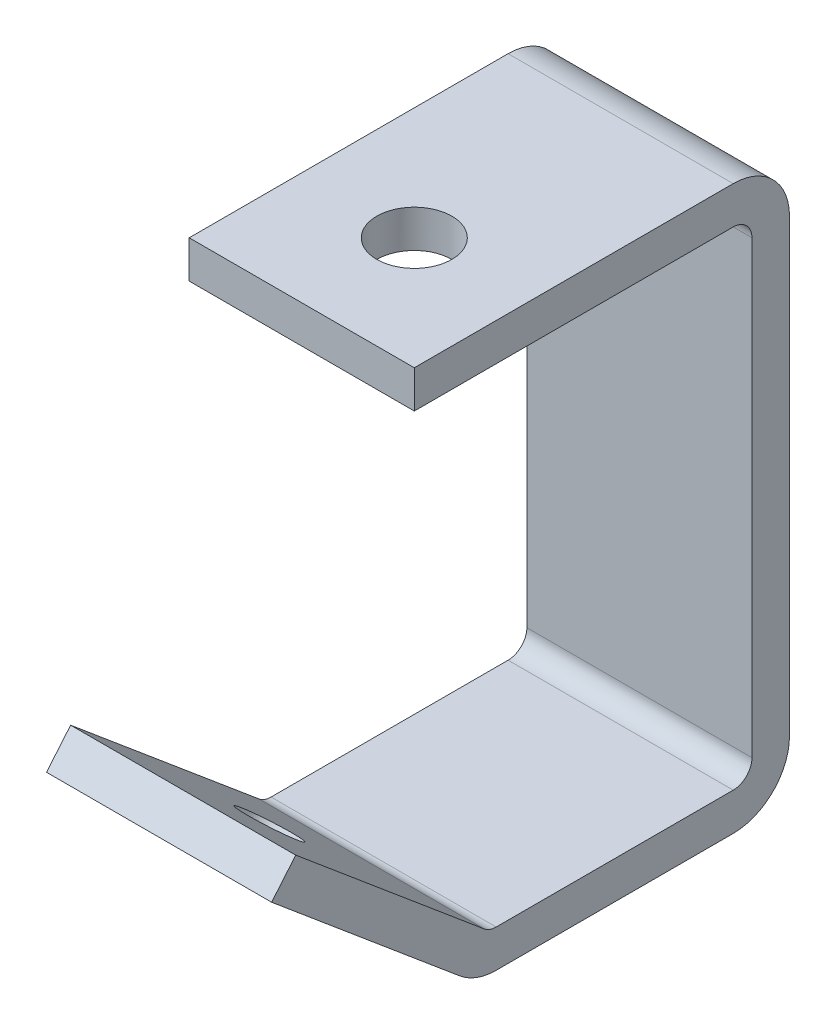
ISO-10303-21;
HEADER;
FILE_DESCRIPTION(('STEP AP214'),'2;1');
FILE_NAME('part.step','',(''),(''),'','','');
FILE_SCHEMA(('AUTOMOTIVE_DESIGN { 1 0 10303 214 1 1 1 1 }'));
ENDSEC;
DATA;
#1=APPLICATION_CONTEXT('core data for automotive mechanical design processes');
#2=APPLICATION_PROTOCOL_DEFINITION('international standard','automotive_design',2000,#1);
#3=PRODUCT_CONTEXT('',#1,'mechanical');
#4=PRODUCT('Part','Part','',(#3));
#5=PRODUCT_RELATED_PRODUCT_CATEGORY('part','',(#4));
#6=PRODUCT_DEFINITION_FORMATION('','',#4);
#7=PRODUCT_DEFINITION_CONTEXT('part definition',#1,'design');
#8=PRODUCT_DEFINITION('design','',#6,#7);
#9=PRODUCT_DEFINITION_SHAPE('','',#8);
#10=(LENGTH_UNIT() NAMED_UNIT(*) SI_UNIT(.MILLI.,.METRE.));
#11=(NAMED_UNIT(*) PLANE_ANGLE_UNIT() SI_UNIT($,.RADIAN.));
#12=(NAMED_UNIT(*) SI_UNIT($,.STERADIAN.) SOLID_ANGLE_UNIT());
#13=UNCERTAINTY_MEASURE_WITH_UNIT(LENGTH_MEASURE(1.E-05),#10,'distance_accuracy_value','');
#14=(GEOMETRIC_REPRESENTATION_CONTEXT(3) GLOBAL_UNCERTAINTY_ASSIGNED_CONTEXT((#13)) GLOBAL_UNIT_ASSIGNED_CONTEXT((#10,
#11,#12)) REPRESENTATION_CONTEXT('',''));
#15=CARTESIAN_POINT('',(0.,0.,0.));
#16=DIRECTION('',(0.,0.,1.));
#17=DIRECTION('',(1.,0.,0.));
#18=AXIS2_PLACEMENT_3D('',#15,#16,#17);
#19=CARTESIAN_POINT('',(19.05,88.9,3.175));
#20=DIRECTION('',(0.,-1.,0.));
#21=DIRECTION('',(0.,0.,-1.));
#22=AXIS2_PLACEMENT_3D('',#19,#20,#21);
#23=PLANE('',#22);
#24=CARTESIAN_POINT('',(0.,88.9,38.1));
#25=DIRECTION('',(0.,1.,0.));
#26=DIRECTION('',(0.,0.,1.));
#27=AXIS2_PLACEMENT_3D('',#24,#25,#26);
#28=CIRCLE('',#27,6.35);
#29=CARTESIAN_POINT('',(0.,88.9,44.45));
#30=VERTEX_POINT('',#29);
#31=EDGE_CURVE('E185',#30,#30,#28,.T.);
#32=ORIENTED_EDGE('',*,*,#31,.F.);
#33=EDGE_LOOP('',(#32));
#34=FACE_BOUND('',#33,.T.);
#35=DIRECTION('',(0.,0.,1.));
#36=VECTOR('',#35,1.);
#37=CARTESIAN_POINT('',(-19.05,88.9,3.175));
#38=LINE('',#37,#36);
#39=CARTESIAN_POINT('',(-19.05,88.9,3.175));
#40=VERTEX_POINT('',#39);
#41=CARTESIAN_POINT('',(-19.05,88.9,57.15));
#42=VERTEX_POINT('',#41);
#43=EDGE_CURVE('E181',#40,#42,#38,.T.);
#44=ORIENTED_EDGE('',*,*,#43,.T.);
#45=DIRECTION('',(-1.,0.,0.));
#46=VECTOR('',#45,1.);
#47=CARTESIAN_POINT('',(19.05,88.9,57.15));
#48=LINE('',#47,#46);
#49=CARTESIAN_POINT('',(19.05,88.9,57.15));
#50=VERTEX_POINT('',#49);
#51=EDGE_CURVE('E11',#50,#42,#48,.T.);
#52=ORIENTED_EDGE('',*,*,#51,.F.);
#53=DIRECTION('',(0.,0.,1.));
#54=VECTOR('',#53,1.);
#55=CARTESIAN_POINT('',(19.05,88.9,3.175));
#56=LINE('',#55,#54);
#57=CARTESIAN_POINT('',(19.05,88.9,3.175));
#58=VERTEX_POINT('',#57);
#59=EDGE_CURVE('E118',#58,#50,#56,.T.);
#60=ORIENTED_EDGE('',*,*,#59,.F.);
#61=DIRECTION('',(-1.,0.,0.));
#62=VECTOR('',#61,1.);
#63=CARTESIAN_POINT('',(19.05,88.9,3.175));
#64=LINE('',#63,#62);
#65=EDGE_CURVE('E177',#58,#40,#64,.T.);
#66=ORIENTED_EDGE('',*,*,#65,.T.);
#67=EDGE_LOOP('',(#44,#52,#60,#66));
#68=FACE_BOUND('',#67,.T.);
#69=ADVANCED_FACE('F37',(#34,#68),#23,.F.);
#70=CARTESIAN_POINT('',(19.05,82.55,57.15));
#71=DIRECTION('',(0.,0.,1.));
#72=DIRECTION('',(1.,0.,0.));
#73=AXIS2_PLACEMENT_3D('',#70,#71,#72);
#74=PLANE('',#73);
#75=DIRECTION('',(0.,1.,0.));
#76=VECTOR('',#75,1.);
#77=CARTESIAN_POINT('',(-19.05,82.55,57.15));
#78=LINE('',#77,#76);
#79=CARTESIAN_POINT('',(-19.05,82.55,57.15));
#80=VERTEX_POINT('',#79);
#81=EDGE_CURVE('E184',#80,#42,#78,.T.);
#82=ORIENTED_EDGE('',*,*,#81,.F.);
#83=DIRECTION('',(-1.,0.,0.));
#84=VECTOR('',#83,1.);
#85=CARTESIAN_POINT('',(19.05,82.55,57.15));
#86=LINE('',#85,#84);
#87=CARTESIAN_POINT('',(19.05,82.55,57.15));
#88=VERTEX_POINT('',#87);
#89=EDGE_CURVE('E46',#88,#80,#86,.T.);
#90=ORIENTED_EDGE('',*,*,#89,.F.);
#91=DIRECTION('',(0.,1.,0.));
#92=VECTOR('',#91,1.);
#93=CARTESIAN_POINT('',(19.05,82.55,57.15));
#94=LINE('',#93,#92);
#95=EDGE_CURVE('E268',#88,#50,#94,.T.);
#96=ORIENTED_EDGE('',*,*,#95,.T.);
#97=ORIENTED_EDGE('',*,*,#51,.T.);
#98=EDGE_LOOP('',(#82,#90,#96,#97));
#99=FACE_BOUND('',#98,.T.);
#100=ADVANCED_FACE('F255',(#99),#74,.T.);
#101=CARTESIAN_POINT('',(19.05,82.55,3.175));
#102=DIRECTION('',(0.,-1.,0.));
#103=DIRECTION('',(0.,0.,-1.));
#104=AXIS2_PLACEMENT_3D('',#101,#102,#103);
#105=PLANE('',#104);
#106=CARTESIAN_POINT('',(0.,82.55,38.1));
#107=DIRECTION('',(0.,-1.,0.));
#108=DIRECTION('',(0.,0.,-1.));
#109=AXIS2_PLACEMENT_3D('',#106,#107,#108);
#110=CIRCLE('',#109,6.35);
#111=CARTESIAN_POINT('',(0.,82.55,31.75));
#112=VERTEX_POINT('',#111);
#113=EDGE_CURVE('E324',#112,#112,#110,.F.);
#114=ORIENTED_EDGE('',*,*,#113,.T.);
#115=EDGE_LOOP('',(#114));
#116=FACE_BOUND('',#115,.T.);
#117=DIRECTION('',(0.,0.,1.));
#118=VECTOR('',#117,1.);
#119=CARTESIAN_POINT('',(-19.05,82.55,3.175));
#120=LINE('',#119,#118);
#121=CARTESIAN_POINT('',(-19.05,82.55,3.175));
#122=VERTEX_POINT('',#121);
#123=EDGE_CURVE('E188',#122,#80,#120,.T.);
#124=ORIENTED_EDGE('',*,*,#123,.F.);
#125=DIRECTION('',(-1.,0.,0.));
#126=VECTOR('',#125,1.);
#127=CARTESIAN_POINT('',(19.05,82.55,3.175));
#128=LINE('',#127,#126);
#129=CARTESIAN_POINT('',(19.05,82.55,3.175));
#130=VERTEX_POINT('',#129);
#131=EDGE_CURVE('E244',#130,#122,#128,.T.);
#132=ORIENTED_EDGE('',*,*,#131,.F.);
#133=DIRECTION('',(0.,0.,1.));
#134=VECTOR('',#133,1.);
#135=CARTESIAN_POINT('',(19.05,82.55,3.175));
#136=LINE('',#135,#134);
#137=EDGE_CURVE('E252',#130,#88,#136,.T.);
#138=ORIENTED_EDGE('',*,*,#137,.T.);
#139=ORIENTED_EDGE('',*,*,#89,.T.);
#140=EDGE_LOOP('',(#124,#132,#138,#139));
#141=FACE_BOUND('',#140,.T.);
#142=ADVANCED_FACE('F250',(#116,#141),#105,.T.);
#143=CARTESIAN_POINT('',(19.05,79.375,3.175));
#144=DIRECTION('',(-1.,0.,0.));
#145=DIRECTION('',(0.,0.,1.));
#146=AXIS2_PLACEMENT_3D('',#143,#144,#145);
#147=CYLINDRICAL_SURFACE('',#146,3.175);
#148=CARTESIAN_POINT('',(-19.05,79.375,3.175));
#149=DIRECTION('',(1.,0.,0.));
#150=DIRECTION('',(0.,0.,-1.));
#151=AXIS2_PLACEMENT_3D('',#148,#149,#150);
#152=CIRCLE('',#151,3.175);
#153=CARTESIAN_POINT('',(-19.05,79.375,0.));
#154=VERTEX_POINT('',#153);
#155=EDGE_CURVE('E191',#154,#122,#152,.T.);
#156=ORIENTED_EDGE('',*,*,#155,.F.);
#157=DIRECTION('',(-1.,0.,0.));
#158=VECTOR('',#157,1.);
#159=CARTESIAN_POINT('',(19.05,79.375,0.));
#160=LINE('',#159,#158);
#161=CARTESIAN_POINT('',(19.05,79.375,0.));
#162=VERTEX_POINT('',#161);
#163=EDGE_CURVE('E242',#162,#154,#160,.T.);
#164=ORIENTED_EDGE('',*,*,#163,.F.);
#165=CARTESIAN_POINT('',(19.05,79.375,3.175));
#166=DIRECTION('',(1.,0.,0.));
#167=DIRECTION('',(0.,0.,-1.));
#168=AXIS2_PLACEMENT_3D('',#165,#166,#167);
#169=CIRCLE('',#168,3.175);
#170=EDGE_CURVE('E265',#162,#130,#169,.T.);
#171=ORIENTED_EDGE('',*,*,#170,.T.);
#172=ORIENTED_EDGE('',*,*,#131,.T.);
#173=EDGE_LOOP('',(#156,#164,#171,#172));
#174=FACE_BOUND('',#173,.T.);
#175=ADVANCED_FACE('F262',(#174),#147,.F.);
#176=CARTESIAN_POINT('',(19.05,3.175,0.));
#177=DIRECTION('',(0.,0.,1.));
#178=DIRECTION('',(1.,0.,0.));
#179=AXIS2_PLACEMENT_3D('',#176,#177,#178);
#180=PLANE('',#179);
#181=DIRECTION('',(0.,1.,0.));
#182=VECTOR('',#181,1.);
#183=CARTESIAN_POINT('',(-19.05,3.175,0.));
#184=LINE('',#183,#182);
#185=CARTESIAN_POINT('',(-19.05,3.175,0.));
#186=VERTEX_POINT('',#185);
#187=EDGE_CURVE('E194',#186,#154,#184,.T.);
#188=ORIENTED_EDGE('',*,*,#187,.F.);
#189=DIRECTION('',(-1.,0.,0.));
#190=VECTOR('',#189,1.);
#191=CARTESIAN_POINT('',(19.05,3.175,0.));
#192=LINE('',#191,#190);
#193=CARTESIAN_POINT('',(19.05,3.175,0.));
#194=VERTEX_POINT('',#193);
#195=EDGE_CURVE('E240',#194,#186,#192,.T.);
#196=ORIENTED_EDGE('',*,*,#195,.F.);
#197=DIRECTION('',(0.,1.,0.));
#198=VECTOR('',#197,1.);
#199=CARTESIAN_POINT('',(19.05,3.175,0.));
#200=LINE('',#199,#198);
#201=EDGE_CURVE('E270',#194,#162,#200,.T.);
#202=ORIENTED_EDGE('',*,*,#201,.T.);
#203=ORIENTED_EDGE('',*,*,#163,.T.);
#204=EDGE_LOOP('',(#188,#196,#202,#203));
#205=FACE_BOUND('',#204,.T.);
#206=ADVANCED_FACE('F475',(#205),#180,.T.);
#207=CARTESIAN_POINT('',(19.05,3.175,3.175));
#208=DIRECTION('',(-1.,0.,0.));
#209=DIRECTION('',(0.,0.,1.));
#210=AXIS2_PLACEMENT_3D('',#207,#208,#209);
#211=CYLINDRICAL_SURFACE('',#210,3.175);
#212=CARTESIAN_POINT('',(-19.05,3.175,3.175));
#213=DIRECTION('',(1.,0.,0.));
#214=DIRECTION('',(0.,0.,1.));
#215=AXIS2_PLACEMENT_3D('',#212,#213,#214);
#216=CIRCLE('',#215,3.175);
#217=CARTESIAN_POINT('',(-19.05,0.,3.175));
#218=VERTEX_POINT('',#217);
#219=EDGE_CURVE('E197',#218,#186,#216,.T.);
#220=ORIENTED_EDGE('',*,*,#219,.F.);
#221=DIRECTION('',(-1.,0.,0.));
#222=VECTOR('',#221,1.);
#223=CARTESIAN_POINT('',(19.05,0.,3.175));
#224=LINE('',#223,#222);
#225=CARTESIAN_POINT('',(19.05,0.,3.175));
#226=VERTEX_POINT('',#225);
#227=EDGE_CURVE('E238',#226,#218,#224,.T.);
#228=ORIENTED_EDGE('',*,*,#227,.F.);
#229=CARTESIAN_POINT('',(19.05,3.175,3.175));
#230=DIRECTION('',(1.,0.,0.));
#231=DIRECTION('',(0.,0.,1.));
#232=AXIS2_PLACEMENT_3D('',#229,#230,#231);
#233=CIRCLE('',#232,3.175);
#234=EDGE_CURVE('E276',#226,#194,#233,.T.);
#235=ORIENTED_EDGE('',*,*,#234,.T.);
#236=ORIENTED_EDGE('',*,*,#195,.T.);
#237=EDGE_LOOP('',(#220,#228,#235,#236));
#238=FACE_BOUND('',#237,.T.);
#239=ADVANCED_FACE('F465',(#238),#211,.F.);
#240=CARTESIAN_POINT('',(19.05,0.,43.2943945062048));
#241=DIRECTION('',(0.,1.,0.));
#242=DIRECTION('',(0.,0.,1.));
#243=AXIS2_PLACEMENT_3D('',#240,#241,#242);
#244=PLANE('',#243);
#245=DIRECTION('',(0.,0.,-1.));
#246=VECTOR('',#245,1.);
#247=CARTESIAN_POINT('',(-19.05,0.,43.2943945062048));
#248=LINE('',#247,#246);
#249=CARTESIAN_POINT('',(-19.05,0.,43.2943945062048));
#250=VERTEX_POINT('',#249);
#251=EDGE_CURVE('E200',#250,#218,#248,.T.);
#252=ORIENTED_EDGE('',*,*,#251,.F.);
#253=DIRECTION('',(-1.,0.,0.));
#254=VECTOR('',#253,1.);
#255=CARTESIAN_POINT('',(19.05,0.,43.2943945062048));
#256=LINE('',#255,#254);
#257=CARTESIAN_POINT('',(19.05,0.,43.2943945062048));
#258=VERTEX_POINT('',#257);
#259=EDGE_CURVE('E236',#258,#250,#256,.T.);
#260=ORIENTED_EDGE('',*,*,#259,.F.);
#261=DIRECTION('',(0.,0.,-1.));
#262=VECTOR('',#261,1.);
#263=CARTESIAN_POINT('',(19.05,0.,43.2943945062048));
#264=LINE('',#263,#262);
#265=EDGE_CURVE('E279',#258,#226,#264,.T.);
#266=ORIENTED_EDGE('',*,*,#265,.T.);
#267=ORIENTED_EDGE('',*,*,#227,.T.);
#268=EDGE_LOOP('',(#252,#260,#266,#267));
#269=FACE_BOUND('',#268,.T.);
#270=ADVANCED_FACE('F455',(#269),#244,.T.);
#271=CARTESIAN_POINT('',(19.05,3.175,43.2943945062048));
#272=DIRECTION('',(-1.,0.,0.));
#273=DIRECTION('',(0.,0.,1.));
#274=AXIS2_PLACEMENT_3D('',#271,#272,#273);
#275=CYLINDRICAL_SURFACE('',#274,3.175);
#276=CARTESIAN_POINT('',(-19.05,3.175,43.2943945062048));
#277=DIRECTION('',(1.,0.,0.));
#278=DIRECTION('',(0.,0.,-1.));
#279=AXIS2_PLACEMENT_3D('',#276,#277,#278);
#280=CIRCLE('',#279,3.175);
#281=CARTESIAN_POINT('',(-19.05,0.742808893097251,45.3352451669596));
#282=VERTEX_POINT('',#281);
#283=EDGE_CURVE('E203',#282,#250,#280,.T.);
#284=ORIENTED_EDGE('',*,*,#283,.F.);
#285=DIRECTION('',(-1.,0.,0.));
#286=VECTOR('',#285,1.);
#287=CARTESIAN_POINT('',(19.05,0.742808893097251,45.3352451669596));
#288=LINE('',#287,#286);
#289=CARTESIAN_POINT('',(19.05,0.742808893097251,45.3352451669596));
#290=VERTEX_POINT('',#289);
#291=EDGE_CURVE('E234',#290,#282,#288,.T.);
#292=ORIENTED_EDGE('',*,*,#291,.F.);
#293=CARTESIAN_POINT('',(19.05,3.175,43.2943945062048));
#294=DIRECTION('',(1.,0.,0.));
#295=DIRECTION('',(0.,0.,-1.));
#296=AXIS2_PLACEMENT_3D('',#293,#294,#295);
#297=CIRCLE('',#296,3.175);
#298=EDGE_CURVE('E282',#290,#258,#297,.T.);
#299=ORIENTED_EDGE('',*,*,#298,.T.);
#300=ORIENTED_EDGE('',*,*,#259,.T.);
#301=EDGE_LOOP('',(#284,#292,#299,#300));
#302=FACE_BOUND('',#301,.T.);
#303=ADVANCED_FACE('F374',(#302),#275,.F.);
#304=CARTESIAN_POINT('',(19.05,27.4943401016882,77.2164785921939));
#305=DIRECTION('',(0.,0.766044443118977,-0.64278760968654));
#306=DIRECTION('',(0.,0.64278760968654,0.766044443118977));
#307=AXIS2_PLACEMENT_3D('',#304,#305,#306);
#308=PLANE('',#307);
#309=CARTESIAN_POINT('',(0.,15.2389046355405,62.611019346606));
#310=DIRECTION('',(0.,0.766044443118977,-0.64278760968654));
#311=DIRECTION('',(0.,0.642787609686541,0.766044443118977));
#312=AXIS2_PLACEMENT_3D('',#309,#310,#311);
#313=CIRCLE('',#312,4.7625);
#314=CARTESIAN_POINT('',(0.,18.3001806266727,66.2593060069601));
#315=VERTEX_POINT('',#314);
#316=EDGE_CURVE('E329',#315,#315,#313,.T.);
#317=ORIENTED_EDGE('',*,*,#316,.F.);
#318=EDGE_LOOP('',(#317));
#319=FACE_BOUND('',#318,.T.);
#320=DIRECTION('',(0.,-0.64278760968654,-0.766044443118977));
#321=VECTOR('',#320,1.);
#322=CARTESIAN_POINT('',(-19.05,27.4943401016882,77.2164785921939));
#323=LINE('',#322,#321);
#324=CARTESIAN_POINT('',(-19.05,27.4943401016882,77.2164785921939));
#325=VERTEX_POINT('',#324);
#326=EDGE_CURVE('E206',#325,#282,#323,.T.);
#327=ORIENTED_EDGE('',*,*,#326,.F.);
#328=DIRECTION('',(-1.,0.,0.));
#329=VECTOR('',#328,1.);
#330=CARTESIAN_POINT('',(19.05,27.4943401016882,77.2164785921939));
#331=LINE('',#330,#329);
#332=CARTESIAN_POINT('',(19.05,27.4943401016882,77.2164785921939));
#333=VERTEX_POINT('',#332);
#334=EDGE_CURVE('E232',#333,#325,#331,.T.);
#335=ORIENTED_EDGE('',*,*,#334,.F.);
#336=DIRECTION('',(0.,-0.64278760968654,-0.766044443118977));
#337=VECTOR('',#336,1.);
#338=CARTESIAN_POINT('',(19.05,27.4943401016882,77.2164785921939));
#339=LINE('',#338,#337);
#340=EDGE_CURVE('E285',#333,#290,#339,.T.);
#341=ORIENTED_EDGE('',*,*,#340,.T.);
#342=ORIENTED_EDGE('',*,*,#291,.T.);
#343=EDGE_LOOP('',(#327,#335,#341,#342));
#344=FACE_BOUND('',#343,.T.);
#345=ADVANCED_FACE('F368',(#319,#344),#308,.T.);
#346=CARTESIAN_POINT('',(19.05,22.6299578878827,81.2981799137034));
#347=DIRECTION('',(0.,0.642787609686541,0.766044443118977));
#348=DIRECTION('',(0.,-0.766044443118977,0.642787609686541));
#349=AXIS2_PLACEMENT_3D('',#346,#347,#348);
#350=PLANE('',#349);
#351=DIRECTION('',(0.,0.766044443118977,-0.642787609686541));
#352=VECTOR('',#351,1.);
#353=CARTESIAN_POINT('',(-19.05,22.6299578878827,81.2981799137034));
#354=LINE('',#353,#352);
#355=CARTESIAN_POINT('',(-19.05,22.6299578878827,81.2981799137034));
#356=VERTEX_POINT('',#355);
#357=EDGE_CURVE('E209',#356,#325,#354,.T.);
#358=ORIENTED_EDGE('',*,*,#357,.F.);
#359=DIRECTION('',(-1.,0.,0.));
#360=VECTOR('',#359,1.);
#361=CARTESIAN_POINT('',(19.05,22.6299578878827,81.2981799137034));
#362=LINE('',#361,#360);
#363=CARTESIAN_POINT('',(19.05,22.6299578878827,81.2981799137034));
#364=VERTEX_POINT('',#363);
#365=EDGE_CURVE('E230',#364,#356,#362,.T.);
#366=ORIENTED_EDGE('',*,*,#365,.F.);
#367=DIRECTION('',(0.,0.766044443118977,-0.642787609686541));
#368=VECTOR('',#367,1.);
#369=CARTESIAN_POINT('',(19.05,22.6299578878827,81.2981799137034));
#370=LINE('',#369,#368);
#371=EDGE_CURVE('E288',#364,#333,#370,.T.);
#372=ORIENTED_EDGE('',*,*,#371,.T.);
#373=ORIENTED_EDGE('',*,*,#334,.T.);
#374=EDGE_LOOP('',(#358,#366,#372,#373));
#375=FACE_BOUND('',#374,.T.);
#376=ADVANCED_FACE('F373',(#375),#350,.T.);
#377=CARTESIAN_POINT('',(19.05,22.6299578878827,81.2981799137034));
#378=DIRECTION('',(0.,0.766044443118977,-0.64278760968654));
#379=DIRECTION('',(0.,0.64278760968654,0.766044443118977));
#380=AXIS2_PLACEMENT_3D('',#377,#378,#379);
#381=PLANE('',#380);
#382=CARTESIAN_POINT('',(0.,10.374522421735,66.6927206681155));
#383=DIRECTION('',(0.,0.766044443118977,-0.64278760968654));
#384=DIRECTION('',(0.,0.64278760968654,0.766044443118977));
#385=AXIS2_PLACEMENT_3D('',#382,#383,#384);
#386=CIRCLE('',#385,4.7625);
#387=CARTESIAN_POINT('',(0.,13.4357984128672,70.3410073284696));
#388=VERTEX_POINT('',#387);
#389=EDGE_CURVE('E40',#388,#388,#386,.T.);
#390=ORIENTED_EDGE('',*,*,#389,.T.);
#391=EDGE_LOOP('',(#390));
#392=FACE_BOUND('',#391,.T.);
#393=DIRECTION('',(0.,-0.64278760968654,-0.766044443118977));
#394=VECTOR('',#393,1.);
#395=CARTESIAN_POINT('',(-19.05,22.6299578878827,81.2981799137034));
#396=LINE('',#395,#394);
#397=CARTESIAN_POINT('',(-19.05,-4.12157332070825,49.4169464884691));
#398=VERTEX_POINT('',#397);
#399=EDGE_CURVE('E212',#356,#398,#396,.T.);
#400=ORIENTED_EDGE('',*,*,#399,.T.);
#401=DIRECTION('',(-1.,0.,0.));
#402=VECTOR('',#401,1.);
#403=CARTESIAN_POINT('',(19.05,-4.12157332070825,49.4169464884691));
#404=LINE('',#403,#402);
#405=CARTESIAN_POINT('',(19.05,-4.12157332070825,49.4169464884691));
#406=VERTEX_POINT('',#405);
#407=EDGE_CURVE('E227',#406,#398,#404,.T.);
#408=ORIENTED_EDGE('',*,*,#407,.F.);
#409=DIRECTION('',(0.,-0.64278760968654,-0.766044443118977));
#410=VECTOR('',#409,1.);
#411=CARTESIAN_POINT('',(19.05,22.6299578878827,81.2981799137034));
#412=LINE('',#411,#410);
#413=EDGE_CURVE('E291',#364,#406,#412,.T.);
#414=ORIENTED_EDGE('',*,*,#413,.F.);
#415=ORIENTED_EDGE('',*,*,#365,.T.);
#416=EDGE_LOOP('',(#400,#408,#414,#415));
#417=FACE_BOUND('',#416,.T.);
#418=ADVANCED_FACE('F336',(#392,#417),#381,.F.);
#419=CARTESIAN_POINT('',(19.05,3.175,43.2943945062048));
#420=DIRECTION('',(-1.,0.,0.));
#421=DIRECTION('',(0.,0.,1.));
#422=AXIS2_PLACEMENT_3D('',#419,#420,#421);
#423=CYLINDRICAL_SURFACE('',#422,9.525);
#424=CARTESIAN_POINT('',(-19.05,3.175,43.2943945062048));
#425=DIRECTION('',(1.,0.,0.));
#426=DIRECTION('',(0.,0.,-1.));
#427=AXIS2_PLACEMENT_3D('',#424,#425,#426);
#428=CIRCLE('',#427,9.525);
#429=CARTESIAN_POINT('',(-19.05,-6.35,43.2943945062048));
#430=VERTEX_POINT('',#429);
#431=EDGE_CURVE('E214',#398,#430,#428,.T.);
#432=ORIENTED_EDGE('',*,*,#431,.T.);
#433=DIRECTION('',(-1.,0.,0.));
#434=VECTOR('',#433,1.);
#435=CARTESIAN_POINT('',(19.05,-6.35,43.2943945062048));
#436=LINE('',#435,#434);
#437=CARTESIAN_POINT('',(19.05,-6.35,43.2943945062048));
#438=VERTEX_POINT('',#437);
#439=EDGE_CURVE('E224',#438,#430,#436,.T.);
#440=ORIENTED_EDGE('',*,*,#439,.F.);
#441=CARTESIAN_POINT('',(19.05,3.175,43.2943945062048));
#442=DIRECTION('',(1.,0.,0.));
#443=DIRECTION('',(0.,0.,-1.));
#444=AXIS2_PLACEMENT_3D('',#441,#442,#443);
#445=CIRCLE('',#444,9.525);
#446=EDGE_CURVE('E293',#406,#438,#445,.T.);
#447=ORIENTED_EDGE('',*,*,#446,.F.);
#448=ORIENTED_EDGE('',*,*,#407,.T.);
#449=EDGE_LOOP('',(#432,#440,#447,#448));
#450=FACE_BOUND('',#449,.T.);
#451=ADVANCED_FACE('F300',(#450),#423,.T.);
#452=CARTESIAN_POINT('',(19.05,-6.35,43.2943945062048));
#453=DIRECTION('',(0.,1.,0.));
#454=DIRECTION('',(0.,0.,1.));
#455=AXIS2_PLACEMENT_3D('',#452,#453,#454);
#456=PLANE('',#455);
#457=DIRECTION('',(0.,0.,-1.));
#458=VECTOR('',#457,1.);
#459=CARTESIAN_POINT('',(-19.05,-6.35,43.2943945062048));
#460=LINE('',#459,#458);
#461=CARTESIAN_POINT('',(-19.05,-6.35,3.17499999999999));
#462=VERTEX_POINT('',#461);
#463=EDGE_CURVE('E216',#430,#462,#460,.T.);
#464=ORIENTED_EDGE('',*,*,#463,.T.);
#465=DIRECTION('',(-1.,0.,0.));
#466=VECTOR('',#465,1.);
#467=CARTESIAN_POINT('',(19.05,-6.35,3.17499999999999));
#468=LINE('',#467,#466);
#469=CARTESIAN_POINT('',(19.05,-6.35,3.17499999999999));
#470=VERTEX_POINT('',#469);
#471=EDGE_CURVE('E172',#470,#462,#468,.T.);
#472=ORIENTED_EDGE('',*,*,#471,.F.);
#473=DIRECTION('',(0.,0.,-1.));
#474=VECTOR('',#473,1.);
#475=CARTESIAN_POINT('',(19.05,-6.35,43.2943945062048));
#476=LINE('',#475,#474);
#477=EDGE_CURVE('E163',#438,#470,#476,.T.);
#478=ORIENTED_EDGE('',*,*,#477,.F.);
#479=ORIENTED_EDGE('',*,*,#439,.T.);
#480=EDGE_LOOP('',(#464,#472,#478,#479));
#481=FACE_BOUND('',#480,.T.);
#482=ADVANCED_FACE('F304',(#481),#456,.F.);
#483=CARTESIAN_POINT('',(19.05,3.175,3.175));
#484=DIRECTION('',(-1.,0.,0.));
#485=DIRECTION('',(0.,0.,1.));
#486=AXIS2_PLACEMENT_3D('',#483,#484,#485);
#487=CYLINDRICAL_SURFACE('',#486,9.525);
#488=CARTESIAN_POINT('',(-19.05,3.175,3.175));
#489=DIRECTION('',(1.,0.,0.));
#490=DIRECTION('',(0.,0.,-1.));
#491=AXIS2_PLACEMENT_3D('',#488,#489,#490);
#492=CIRCLE('',#491,9.525);
#493=CARTESIAN_POINT('',(-19.05,3.175,-6.35));
#494=VERTEX_POINT('',#493);
#495=EDGE_CURVE('E171',#462,#494,#492,.T.);
#496=ORIENTED_EDGE('',*,*,#495,.T.);
#497=DIRECTION('',(-1.,0.,0.));
#498=VECTOR('',#497,1.);
#499=CARTESIAN_POINT('',(19.05,3.175,-6.35));
#500=LINE('',#499,#498);
#501=CARTESIAN_POINT('',(19.05,3.175,-6.35));
#502=VERTEX_POINT('',#501);
#503=EDGE_CURVE('E168',#502,#494,#500,.T.);
#504=ORIENTED_EDGE('',*,*,#503,.F.);
#505=CARTESIAN_POINT('',(19.05,3.175,3.175));
#506=DIRECTION('',(1.,0.,0.));
#507=DIRECTION('',(0.,0.,-1.));
#508=AXIS2_PLACEMENT_3D('',#505,#506,#507);
#509=CIRCLE('',#508,9.525);
#510=EDGE_CURVE('E157',#470,#502,#509,.T.);
#511=ORIENTED_EDGE('',*,*,#510,.F.);
#512=ORIENTED_EDGE('',*,*,#471,.T.);
#513=EDGE_LOOP('',(#496,#504,#511,#512));
#514=FACE_BOUND('',#513,.T.);
#515=ADVANCED_FACE('F169',(#514),#487,.T.);
#516=CARTESIAN_POINT('',(19.05,3.175,-6.35));
#517=DIRECTION('',(0.,0.,1.));
#518=DIRECTION('',(1.,0.,0.));
#519=AXIS2_PLACEMENT_3D('',#516,#517,#518);
#520=PLANE('',#519);
#521=DIRECTION('',(0.,1.,0.));
#522=VECTOR('',#521,1.);
#523=CARTESIAN_POINT('',(-19.05,3.175,-6.35));
#524=LINE('',#523,#522);
#525=CARTESIAN_POINT('',(-19.05,79.375,-6.35));
#526=VERTEX_POINT('',#525);
#527=EDGE_CURVE('E106',#494,#526,#524,.T.);
#528=ORIENTED_EDGE('',*,*,#527,.T.);
#529=DIRECTION('',(-1.,0.,0.));
#530=VECTOR('',#529,1.);
#531=CARTESIAN_POINT('',(19.05,79.375,-6.35));
#532=LINE('',#531,#530);
#533=CARTESIAN_POINT('',(19.05,79.375,-6.35));
#534=VERTEX_POINT('',#533);
#535=EDGE_CURVE('E173',#534,#526,#532,.T.);
#536=ORIENTED_EDGE('',*,*,#535,.F.);
#537=DIRECTION('',(0.,1.,0.));
#538=VECTOR('',#537,1.);
#539=CARTESIAN_POINT('',(19.05,3.175,-6.35));
#540=LINE('',#539,#538);
#541=EDGE_CURVE('E161',#502,#534,#540,.T.);
#542=ORIENTED_EDGE('',*,*,#541,.F.);
#543=ORIENTED_EDGE('',*,*,#503,.T.);
#544=EDGE_LOOP('',(#528,#536,#542,#543));
#545=FACE_BOUND('',#544,.T.);
#546=ADVANCED_FACE('F175',(#545),#520,.F.);
#547=CARTESIAN_POINT('',(19.05,79.375,3.175));
#548=DIRECTION('',(-1.,0.,0.));
#549=DIRECTION('',(0.,0.,1.));
#550=AXIS2_PLACEMENT_3D('',#547,#548,#549);
#551=CYLINDRICAL_SURFACE('',#550,9.525);
#552=CARTESIAN_POINT('',(-19.05,79.375,3.175));
#553=DIRECTION('',(1.,0.,0.));
#554=DIRECTION('',(0.,0.,-1.));
#555=AXIS2_PLACEMENT_3D('',#552,#553,#554);
#556=CIRCLE('',#555,9.525);
#557=EDGE_CURVE('E112',#526,#40,#556,.T.);
#558=ORIENTED_EDGE('',*,*,#557,.T.);
#559=ORIENTED_EDGE('',*,*,#65,.F.);
#560=CARTESIAN_POINT('',(19.05,79.375,3.175));
#561=DIRECTION('',(1.,0.,0.));
#562=DIRECTION('',(0.,0.,-1.));
#563=AXIS2_PLACEMENT_3D('',#560,#561,#562);
#564=CIRCLE('',#563,9.525);
#565=EDGE_CURVE('E54',#534,#58,#564,.T.);
#566=ORIENTED_EDGE('',*,*,#565,.F.);
#567=ORIENTED_EDGE('',*,*,#535,.T.);
#568=EDGE_LOOP('',(#558,#559,#566,#567));
#569=FACE_BOUND('',#568,.T.);
#570=ADVANCED_FACE('F306',(#569),#551,.T.);
#571=CARTESIAN_POINT('',(19.05,79.375,3.175));
#572=DIRECTION('',(1.,0.,0.));
#573=DIRECTION('',(0.,0.,-1.));
#574=AXIS2_PLACEMENT_3D('',#571,#572,#573);
#575=PLANE('',#574);
#576=ORIENTED_EDGE('',*,*,#59,.T.);
#577=ORIENTED_EDGE('',*,*,#95,.F.);
#578=ORIENTED_EDGE('',*,*,#137,.F.);
#579=ORIENTED_EDGE('',*,*,#170,.F.);
#580=ORIENTED_EDGE('',*,*,#201,.F.);
#581=ORIENTED_EDGE('',*,*,#234,.F.);
#582=ORIENTED_EDGE('',*,*,#265,.F.);
#583=ORIENTED_EDGE('',*,*,#298,.F.);
#584=ORIENTED_EDGE('',*,*,#340,.F.);
#585=ORIENTED_EDGE('',*,*,#371,.F.);
#586=ORIENTED_EDGE('',*,*,#413,.T.);
#587=ORIENTED_EDGE('',*,*,#446,.T.);
#588=ORIENTED_EDGE('',*,*,#477,.T.);
#589=ORIENTED_EDGE('',*,*,#510,.T.);
#590=ORIENTED_EDGE('',*,*,#541,.T.);
#591=ORIENTED_EDGE('',*,*,#565,.T.);
#592=EDGE_LOOP('',(#576,#577,#578,#579,#580,#581,#582,#583,#584,#585,#586,#587,#588,#589,#590,#591));
#593=FACE_BOUND('',#592,.T.);
#594=ADVANCED_FACE('F159',(#593),#575,.T.);
#595=CARTESIAN_POINT('',(-19.05,79.375,3.175));
#596=DIRECTION('',(1.,0.,0.));
#597=DIRECTION('',(0.,0.,-1.));
#598=AXIS2_PLACEMENT_3D('',#595,#596,#597);
#599=PLANE('',#598);
#600=ORIENTED_EDGE('',*,*,#43,.F.);
#601=ORIENTED_EDGE('',*,*,#557,.F.);
#602=ORIENTED_EDGE('',*,*,#527,.F.);
#603=ORIENTED_EDGE('',*,*,#495,.F.);
#604=ORIENTED_EDGE('',*,*,#463,.F.);
#605=ORIENTED_EDGE('',*,*,#431,.F.);
#606=ORIENTED_EDGE('',*,*,#399,.F.);
#607=ORIENTED_EDGE('',*,*,#357,.T.);
#608=ORIENTED_EDGE('',*,*,#326,.T.);
#609=ORIENTED_EDGE('',*,*,#283,.T.);
#610=ORIENTED_EDGE('',*,*,#251,.T.);
#611=ORIENTED_EDGE('',*,*,#219,.T.);
#612=ORIENTED_EDGE('',*,*,#187,.T.);
#613=ORIENTED_EDGE('',*,*,#155,.T.);
#614=ORIENTED_EDGE('',*,*,#123,.T.);
#615=ORIENTED_EDGE('',*,*,#81,.T.);
#616=EDGE_LOOP('',(#600,#601,#602,#603,#604,#605,#606,#607,#608,#609,#610,#611,#612,#613,#614,#615));
#617=FACE_BOUND('',#616,.T.);
#618=ADVANCED_FACE('F258',(#617),#599,.F.);
#619=CARTESIAN_POINT('',(0.,-6.35100000000001,38.1000000000001));
#620=DIRECTION('',(0.,1.,0.));
#621=DIRECTION('',(0.,0.,1.));
#622=AXIS2_PLACEMENT_3D('',#619,#620,#621);
#623=CYLINDRICAL_SURFACE('',#622,6.35);
#624=ORIENTED_EDGE('',*,*,#113,.F.);
#625=EDGE_LOOP('',(#624));
#626=FACE_BOUND('',#625,.T.);
#627=ORIENTED_EDGE('',*,*,#31,.T.);
#628=EDGE_LOOP('',(#627));
#629=FACE_BOUND('',#628,.T.);
#630=ADVANCED_FACE('F341',(#626,#629),#623,.F.);
#631=CARTESIAN_POINT('',(0.,-6.63161496025388,80.9625642730926));
#632=DIRECTION('',(0.,0.766044443118977,-0.64278760968654));
#633=DIRECTION('',(0.,0.642787609686541,0.766044443118977));
#634=AXIS2_PLACEMENT_3D('',#631,#632,#633);
#635=CYLINDRICAL_SURFACE('',#634,4.7625);
#636=CARTESIAN_POINT('',(0.,18.3001806266727,66.2593060069601));
#637=CARTESIAN_POINT('',(0.,18.2495099786122,66.3018237290591));
#638=CARTESIAN_POINT('',(0.,18.1988393305517,66.3443414511582));
#639=CARTESIAN_POINT('',(0.,18.0974980344308,66.4293768953563));
#640=CARTESIAN_POINT('',(0.,18.0468273863703,66.4718946174554));
#641=CARTESIAN_POINT('',(0.,17.9454860902494,66.5569300616535));
#642=CARTESIAN_POINT('',(0.,17.8948154421889,66.5994477837526));
#643=CARTESIAN_POINT('',(0.,17.7934741460679,66.6844832279507));
#644=CARTESIAN_POINT('',(0.,17.7428034980075,66.7270009500497));
#645=CARTESIAN_POINT('',(0.,17.6414622018865,66.8120363942478));
#646=CARTESIAN_POINT('',(0.,17.590791553826,66.8545541163469));
#647=CARTESIAN_POINT('',(0.,17.4894502577051,66.939589560545));
#648=CARTESIAN_POINT('',(0.,17.4387796096446,66.9821072826441));
#649=CARTESIAN_POINT('',(0.,17.3374383135237,67.0671427268422));
#650=CARTESIAN_POINT('',(0.,17.2867676654632,67.1096604489412));
#651=CARTESIAN_POINT('',(0.,17.1854263693423,67.1946958931394));
#652=CARTESIAN_POINT('',(0.,17.1347557212818,67.2372136152384));
#653=CARTESIAN_POINT('',(0.,17.0334144251608,67.3222490594365));
#654=CARTESIAN_POINT('',(0.,16.9827437771004,67.3647667815356));
#655=CARTESIAN_POINT('',(0.,16.8814024809794,67.4498022257337));
#656=CARTESIAN_POINT('',(0.,16.8307318329189,67.4923199478328));
#657=CARTESIAN_POINT('',(0.,16.729390536798,67.5773553920309));
#658=CARTESIAN_POINT('',(0.,16.6787198887375,67.6198731141299));
#659=CARTESIAN_POINT('',(0.,16.5773785926166,67.704908558328));
#660=CARTESIAN_POINT('',(0.,16.5267079445561,67.7474262804271));
#661=CARTESIAN_POINT('',(0.,16.4253666484351,67.8324617246252));
#662=CARTESIAN_POINT('',(0.,16.3746960003747,67.8749794467243));
#663=CARTESIAN_POINT('',(0.,16.2733547042537,67.9600148909224));
#664=CARTESIAN_POINT('',(0.,16.2226840561932,68.0025326130215));
#665=CARTESIAN_POINT('',(0.,16.1213427600723,68.0875680572196));
#666=CARTESIAN_POINT('',(0.,16.0706721120118,68.1300857793186));
#667=CARTESIAN_POINT('',(0.,15.9693308158909,68.2151212235167));
#668=CARTESIAN_POINT('',(0.,15.9186601678304,68.2576389456158));
#669=CARTESIAN_POINT('',(0.,15.8173188717095,68.3426743898139));
#670=CARTESIAN_POINT('',(0.,15.766648223649,68.385192111913));
#671=CARTESIAN_POINT('',(0.,15.665306927528,68.4702275561111));
#672=CARTESIAN_POINT('',(0.,15.6146362794676,68.5127452782101));
#673=CARTESIAN_POINT('',(0.,15.5132949833466,68.5977807224083));
#674=CARTESIAN_POINT('',(0.,15.4626243352861,68.6402984445073));
#675=CARTESIAN_POINT('',(0.,15.3612830391652,68.7253338887054));
#676=CARTESIAN_POINT('',(0.,15.3106123911047,68.7678516108045));
#677=CARTESIAN_POINT('',(0.,15.2092710949838,68.8528870550026));
#678=CARTESIAN_POINT('',(0.,15.1586004469233,68.8954047771017));
#679=CARTESIAN_POINT('',(0.,15.0572591508024,68.9804402212998));
#680=CARTESIAN_POINT('',(0.,15.0065885027419,69.0229579433988));
#681=CARTESIAN_POINT('',(0.,14.9052472066209,69.1079933875969));
#682=CARTESIAN_POINT('',(0.,14.8545765585605,69.150511109696));
#683=CARTESIAN_POINT('',(0.,14.7532352624395,69.2355465538941));
#684=CARTESIAN_POINT('',(0.,14.702564614379,69.2780642759932));
#685=CARTESIAN_POINT('',(0.,14.6012233182581,69.3630997201913));
#686=CARTESIAN_POINT('',(0.,14.5505526701976,69.4056174422903));
#687=CARTESIAN_POINT('',(0.,14.4492113740767,69.4906528864884));
#688=CARTESIAN_POINT('',(0.,14.3985407260162,69.5331706085875));
#689=CARTESIAN_POINT('',(0.,14.2971994298952,69.6182060527856));
#690=CARTESIAN_POINT('',(0.,14.2465287818348,69.6607237748847));
#691=CARTESIAN_POINT('',(0.,14.1451874857138,69.7457592190828));
#692=CARTESIAN_POINT('',(0.,14.0945168376534,69.7882769411819));
#693=CARTESIAN_POINT('',(0.,13.9931755415324,69.87331238538));
#694=CARTESIAN_POINT('',(0.,13.9425048934719,69.915830107479));
#695=CARTESIAN_POINT('',(0.,13.841163597351,70.0008655516771));
#696=CARTESIAN_POINT('',(0.,13.7904929492905,70.0433832737762));
#697=CARTESIAN_POINT('',(0.,13.6891516531696,70.1284187179743));
#698=CARTESIAN_POINT('',(0.,13.6384810051091,70.1709364400734));
#699=CARTESIAN_POINT('',(0.,13.5371397089881,70.2559718842715));
#700=CARTESIAN_POINT('',(0.,13.4864690609277,70.2984896063706));
#701=CARTESIAN_POINT('',(0.,13.4357984128672,70.3410073284696));
#702=B_SPLINE_CURVE_WITH_KNOTS('',3,(#636,#637,#638,#639,#640,#641,#642,#643,#644,#645,#646,
#647,#648,#649,#650,#651,#652,#653,#654,#655,#656,#657,#658,#659,#660,#661,#662,#663,#664,#665,
#666,#667,#668,#669,#670,#671,#672,#673,#674,#675,#676,#677,#678,#679,#680,#681,#682,#683,#684,
#685,#686,#687,#688,#689,#690,#691,#692,#693,#694,#695,#696,#697,#698,#699,#700,#701),
.UNSPECIFIED.,.F.,.F.,(4,2,2,2,2,2,2,2,2,2,2,2,2,2,2,2,2,2,2,2,2,2,2,2,2,2,2,2,2,2,2,2,4),(0.,
0.198437499999999,0.396874999999999,0.595312499999998,0.793749999999997,0.992187499999997,
1.190625,1.3890625,1.58749999999999,1.78593749999999,1.98437499999999,2.18281249999999,2.38125,
2.5796875,2.778125,2.9765625,3.17499999999999,3.37343749999999,3.57187499999999,
3.77031249999998,3.96874999999998,4.16718749999999,4.36562499999998,4.56406249999998,
4.76249999999998,4.96093749999998,5.15937499999998,5.35781249999998,5.55624999999998,
5.75468749999998,5.95312499999998,6.15156249999998,6.34999999999998),.UNSPECIFIED.);
#703=EDGE_CURVE('BSEAM339',#315,#388,#702,.T.);
#704=ORIENTED_EDGE('',*,*,#316,.T.);
#705=ORIENTED_EDGE('',*,*,#389,.F.);
#706=ORIENTED_EDGE('',*,*,#703,.T.);
#707=ORIENTED_EDGE('',*,*,#703,.F.);
#708=EDGE_LOOP('',(#704,#706,#705,#707));
#709=FACE_BOUND('',#708,.T.);
#710=ADVANCED_FACE('F339',(#709),#635,.F.);
#711=CLOSED_SHELL('',(#69,#100,#142,#175,#206,#239,#270,#303,#345,#376,#418,#451,#482,#515,#546,
#570,#594,#618,#630,#710));
#712=MANIFOLD_SOLID_BREP('B2',#711);
#713=ADVANCED_BREP_SHAPE_REPRESENTATION('',(#18,#712),#14);
#714=SHAPE_DEFINITION_REPRESENTATION(#9,#713);
ENDSEC;
END-ISO-10303-21;
